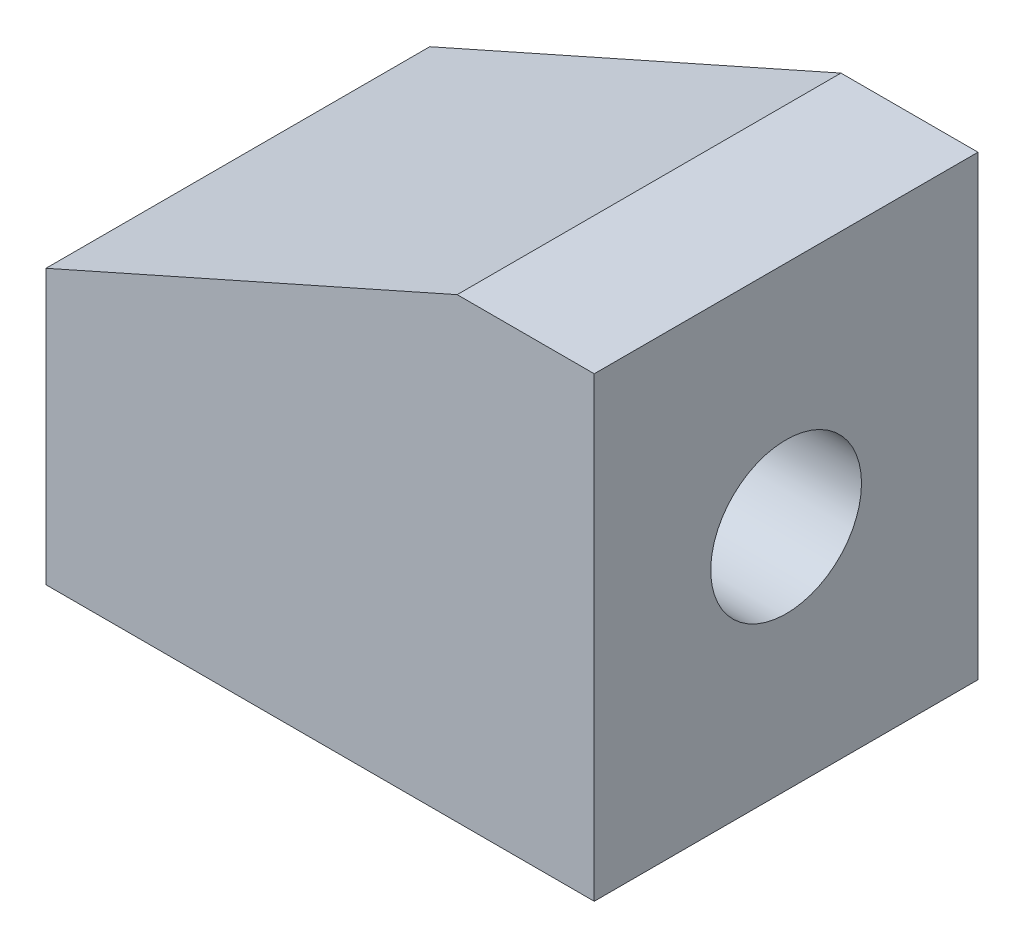
ISO-10303-21;
HEADER;
FILE_DESCRIPTION(('STEP AP214'),'2;1');
FILE_NAME('part.step','',(''),(''),'','','');
FILE_SCHEMA(('AUTOMOTIVE_DESIGN { 1 0 10303 214 1 1 1 1 }'));
ENDSEC;
DATA;
#1=APPLICATION_CONTEXT('core data for automotive mechanical design processes');
#2=APPLICATION_PROTOCOL_DEFINITION('international standard','automotive_design',2000,#1);
#3=PRODUCT_CONTEXT('',#1,'mechanical');
#4=PRODUCT('Part','Part','',(#3));
#5=PRODUCT_RELATED_PRODUCT_CATEGORY('part','',(#4));
#6=PRODUCT_DEFINITION_FORMATION('','',#4);
#7=PRODUCT_DEFINITION_CONTEXT('part definition',#1,'design');
#8=PRODUCT_DEFINITION('design','',#6,#7);
#9=PRODUCT_DEFINITION_SHAPE('','',#8);
#10=(LENGTH_UNIT() NAMED_UNIT(*) SI_UNIT(.MILLI.,.METRE.));
#11=(NAMED_UNIT(*) PLANE_ANGLE_UNIT() SI_UNIT($,.RADIAN.));
#12=(NAMED_UNIT(*) SI_UNIT($,.STERADIAN.) SOLID_ANGLE_UNIT());
#13=UNCERTAINTY_MEASURE_WITH_UNIT(LENGTH_MEASURE(1.E-05),#10,'distance_accuracy_value','');
#14=(GEOMETRIC_REPRESENTATION_CONTEXT(3) GLOBAL_UNCERTAINTY_ASSIGNED_CONTEXT((#13)) GLOBAL_UNIT_ASSIGNED_CONTEXT((#10,
#11,#12)) REPRESENTATION_CONTEXT('',''));
#15=CARTESIAN_POINT('',(0.,0.,0.));
#16=DIRECTION('',(0.,0.,1.));
#17=DIRECTION('',(1.,0.,0.));
#18=AXIS2_PLACEMENT_3D('',#15,#16,#17);
#19=CARTESIAN_POINT('',(-30.,0.,21.));
#20=DIRECTION('',(0.,1.,0.));
#21=DIRECTION('',(0.,0.,1.));
#22=AXIS2_PLACEMENT_3D('',#19,#20,#21);
#23=PLANE('',#22);
#24=DIRECTION('',(1.,0.,0.));
#25=VECTOR('',#24,1.);
#26=CARTESIAN_POINT('',(-30.,0.,-21.));
#27=LINE('',#26,#25);
#28=CARTESIAN_POINT('',(-30.,0.,-21.));
#29=VERTEX_POINT('',#28);
#30=CARTESIAN_POINT('',(30.,0.,-21.));
#31=VERTEX_POINT('',#30);
#32=EDGE_CURVE('E118',#29,#31,#27,.T.);
#33=ORIENTED_EDGE('',*,*,#32,.T.);
#34=DIRECTION('',(0.,0.,-1.));
#35=VECTOR('',#34,1.);
#36=CARTESIAN_POINT('',(30.,0.,21.));
#37=LINE('',#36,#35);
#38=CARTESIAN_POINT('',(30.,0.,21.));
#39=VERTEX_POINT('',#38);
#40=EDGE_CURVE('E11',#39,#31,#37,.T.);
#41=ORIENTED_EDGE('',*,*,#40,.F.);
#42=DIRECTION('',(1.,0.,0.));
#43=VECTOR('',#42,1.);
#44=CARTESIAN_POINT('',(-30.,0.,21.));
#45=LINE('',#44,#43);
#46=CARTESIAN_POINT('',(-30.,0.,21.));
#47=VERTEX_POINT('',#46);
#48=EDGE_CURVE('E127',#47,#39,#45,.T.);
#49=ORIENTED_EDGE('',*,*,#48,.F.);
#50=DIRECTION('',(0.,0.,-1.));
#51=VECTOR('',#50,1.);
#52=CARTESIAN_POINT('',(-30.,0.,21.));
#53=LINE('',#52,#51);
#54=EDGE_CURVE('E114',#47,#29,#53,.T.);
#55=ORIENTED_EDGE('',*,*,#54,.T.);
#56=EDGE_LOOP('',(#33,#41,#49,#55));
#57=FACE_BOUND('',#56,.T.);
#58=ADVANCED_FACE('F42',(#57),#23,.F.);
#59=CARTESIAN_POINT('',(30.,0.,21.));
#60=DIRECTION('',(-1.,0.,0.));
#61=DIRECTION('',(0.,0.,1.));
#62=AXIS2_PLACEMENT_3D('',#59,#60,#61);
#63=PLANE('',#62);
#64=CARTESIAN_POINT('',(30.,25.,0.));
#65=DIRECTION('',(1.,0.,0.));
#66=DIRECTION('',(0.,0.,-1.));
#67=AXIS2_PLACEMENT_3D('',#64,#65,#66);
#68=CIRCLE('',#67,8.24999999999999);
#69=CARTESIAN_POINT('',(30.,25.,-8.24999999999999));
#70=VERTEX_POINT('',#69);
#71=EDGE_CURVE('E157',#70,#70,#68,.T.);
#72=ORIENTED_EDGE('',*,*,#71,.F.);
#73=EDGE_LOOP('',(#72));
#74=FACE_BOUND('',#73,.T.);
#75=DIRECTION('',(0.,1.,0.));
#76=VECTOR('',#75,1.);
#77=CARTESIAN_POINT('',(30.,0.,-21.));
#78=LINE('',#77,#76);
#79=CARTESIAN_POINT('',(30.,50.,-21.));
#80=VERTEX_POINT('',#79);
#81=EDGE_CURVE('E121',#31,#80,#78,.T.);
#82=ORIENTED_EDGE('',*,*,#81,.T.);
#83=DIRECTION('',(0.,0.,-1.));
#84=VECTOR('',#83,1.);
#85=CARTESIAN_POINT('',(30.,50.,21.));
#86=LINE('',#85,#84);
#87=CARTESIAN_POINT('',(30.,50.,21.));
#88=VERTEX_POINT('',#87);
#89=EDGE_CURVE('E50',#88,#80,#86,.T.);
#90=ORIENTED_EDGE('',*,*,#89,.F.);
#91=DIRECTION('',(0.,1.,0.));
#92=VECTOR('',#91,1.);
#93=CARTESIAN_POINT('',(30.,0.,21.));
#94=LINE('',#93,#92);
#95=EDGE_CURVE('E93',#39,#88,#94,.T.);
#96=ORIENTED_EDGE('',*,*,#95,.F.);
#97=ORIENTED_EDGE('',*,*,#40,.T.);
#98=EDGE_LOOP('',(#82,#90,#96,#97));
#99=FACE_BOUND('',#98,.T.);
#100=ADVANCED_FACE('F146',(#74,#99),#63,.F.);
#101=CARTESIAN_POINT('',(30.,50.,21.));
#102=DIRECTION('',(0.,-1.,0.));
#103=DIRECTION('',(1.,0.,0.));
#104=AXIS2_PLACEMENT_3D('',#101,#102,#103);
#105=PLANE('',#104);
#106=DIRECTION('',(-1.,0.,0.));
#107=VECTOR('',#106,1.);
#108=CARTESIAN_POINT('',(30.,50.,-21.));
#109=LINE('',#108,#107);
#110=CARTESIAN_POINT('',(15.,50.,-21.));
#111=VERTEX_POINT('',#110);
#112=EDGE_CURVE('E109',#80,#111,#109,.T.);
#113=ORIENTED_EDGE('',*,*,#112,.T.);
#114=DIRECTION('',(0.,0.,-1.));
#115=VECTOR('',#114,1.);
#116=CARTESIAN_POINT('',(15.,50.,21.));
#117=LINE('',#116,#115);
#118=CARTESIAN_POINT('',(15.,50.,21.));
#119=VERTEX_POINT('',#118);
#120=EDGE_CURVE('E106',#119,#111,#117,.T.);
#121=ORIENTED_EDGE('',*,*,#120,.F.);
#122=DIRECTION('',(-1.,0.,0.));
#123=VECTOR('',#122,1.);
#124=CARTESIAN_POINT('',(30.,50.,21.));
#125=LINE('',#124,#123);
#126=EDGE_CURVE('E98',#88,#119,#125,.T.);
#127=ORIENTED_EDGE('',*,*,#126,.F.);
#128=ORIENTED_EDGE('',*,*,#89,.T.);
#129=EDGE_LOOP('',(#113,#121,#127,#128));
#130=FACE_BOUND('',#129,.T.);
#131=ADVANCED_FACE('F107',(#130),#105,.F.);
#132=CARTESIAN_POINT('',(15.,50.,21.));
#133=DIRECTION('',(0.406138466053448,-0.913811548620257,0.));
#134=DIRECTION('',(0.913811548620257,0.406138466053448,0.));
#135=AXIS2_PLACEMENT_3D('',#132,#133,#134);
#136=PLANE('',#135);
#137=DIRECTION('',(-0.913811548620257,-0.406138466053448,0.));
#138=VECTOR('',#137,1.);
#139=CARTESIAN_POINT('',(15.,50.,-21.));
#140=LINE('',#139,#138);
#141=CARTESIAN_POINT('',(-30.,30.,-21.));
#142=VERTEX_POINT('',#141);
#143=EDGE_CURVE('E79',#111,#142,#140,.T.);
#144=ORIENTED_EDGE('',*,*,#143,.T.);
#145=DIRECTION('',(0.,0.,-1.));
#146=VECTOR('',#145,1.);
#147=CARTESIAN_POINT('',(-30.,30.,21.));
#148=LINE('',#147,#146);
#149=CARTESIAN_POINT('',(-30.,30.,21.));
#150=VERTEX_POINT('',#149);
#151=EDGE_CURVE('E110',#150,#142,#148,.T.);
#152=ORIENTED_EDGE('',*,*,#151,.F.);
#153=DIRECTION('',(-0.913811548620257,-0.406138466053448,0.));
#154=VECTOR('',#153,1.);
#155=CARTESIAN_POINT('',(15.,50.,21.));
#156=LINE('',#155,#154);
#157=EDGE_CURVE('E102',#119,#150,#156,.T.);
#158=ORIENTED_EDGE('',*,*,#157,.F.);
#159=ORIENTED_EDGE('',*,*,#120,.T.);
#160=EDGE_LOOP('',(#144,#152,#158,#159));
#161=FACE_BOUND('',#160,.T.);
#162=ADVANCED_FACE('F112',(#161),#136,.F.);
#163=CARTESIAN_POINT('',(-30.,30.,21.));
#164=DIRECTION('',(1.,0.,0.));
#165=DIRECTION('',(0.,0.,-1.));
#166=AXIS2_PLACEMENT_3D('',#163,#164,#165);
#167=PLANE('',#166);
#168=DIRECTION('',(0.,-1.,0.));
#169=VECTOR('',#168,1.);
#170=CARTESIAN_POINT('',(-30.,30.,-21.));
#171=LINE('',#170,#169);
#172=EDGE_CURVE('E85',#142,#29,#171,.T.);
#173=ORIENTED_EDGE('',*,*,#172,.T.);
#174=ORIENTED_EDGE('',*,*,#54,.F.);
#175=DIRECTION('',(0.,-1.,0.));
#176=VECTOR('',#175,1.);
#177=CARTESIAN_POINT('',(-30.,30.,21.));
#178=LINE('',#177,#176);
#179=EDGE_CURVE('E58',#150,#47,#178,.T.);
#180=ORIENTED_EDGE('',*,*,#179,.F.);
#181=ORIENTED_EDGE('',*,*,#151,.T.);
#182=EDGE_LOOP('',(#173,#174,#180,#181));
#183=FACE_BOUND('',#182,.T.);
#184=ADVANCED_FACE('F135',(#183),#167,.F.);
#185=CARTESIAN_POINT('',(0.,0.,21.));
#186=DIRECTION('',(0.,0.,1.));
#187=DIRECTION('',(1.,0.,0.));
#188=AXIS2_PLACEMENT_3D('',#185,#186,#187);
#189=PLANE('',#188);
#190=ORIENTED_EDGE('',*,*,#48,.T.);
#191=ORIENTED_EDGE('',*,*,#95,.T.);
#192=ORIENTED_EDGE('',*,*,#126,.T.);
#193=ORIENTED_EDGE('',*,*,#157,.T.);
#194=ORIENTED_EDGE('',*,*,#179,.T.);
#195=EDGE_LOOP('',(#190,#191,#192,#193,#194));
#196=FACE_BOUND('',#195,.T.);
#197=ADVANCED_FACE('F100',(#196),#189,.T.);
#198=CARTESIAN_POINT('',(0.,0.,-21.));
#199=DIRECTION('',(0.,0.,1.));
#200=DIRECTION('',(1.,0.,0.));
#201=AXIS2_PLACEMENT_3D('',#198,#199,#200);
#202=PLANE('',#201);
#203=ORIENTED_EDGE('',*,*,#32,.F.);
#204=ORIENTED_EDGE('',*,*,#172,.F.);
#205=ORIENTED_EDGE('',*,*,#143,.F.);
#206=ORIENTED_EDGE('',*,*,#112,.F.);
#207=ORIENTED_EDGE('',*,*,#81,.F.);
#208=EDGE_LOOP('',(#203,#204,#205,#206,#207));
#209=FACE_BOUND('',#208,.T.);
#210=ADVANCED_FACE('F131',(#209),#202,.F.);
#211=CARTESIAN_POINT('',(-8.54289989302262,25.,0.));
#212=DIRECTION('',(1.,0.,0.));
#213=DIRECTION('',(0.,0.,-1.));
#214=AXIS2_PLACEMENT_3D('',#211,#212,#213);
#215=CONICAL_SURFACE('',#214,8.24999999999999,1.02974425867665);
#216=CARTESIAN_POINT('',(-13.5,25.,0.));
#217=VERTEX_POINT('',#216);
#218=VERTEX_LOOP('',#217);
#219=FACE_BOUND('',#218,.T.);
#220=CARTESIAN_POINT('',(-8.54289989302262,25.,0.));
#221=DIRECTION('',(1.,0.,0.));
#222=DIRECTION('',(0.,0.,-1.));
#223=AXIS2_PLACEMENT_3D('',#220,#221,#222);
#224=CIRCLE('',#223,8.24999999999999);
#225=CARTESIAN_POINT('',(-8.54289989302262,25.,-8.24999999999999));
#226=VERTEX_POINT('',#225);
#227=EDGE_CURVE('E122',#226,#226,#224,.T.);
#228=ORIENTED_EDGE('',*,*,#227,.T.);
#229=EDGE_LOOP('',(#228));
#230=FACE_BOUND('',#229,.T.);
#231=ADVANCED_FACE('F165',(#219,#230),#215,.F.);
#232=CARTESIAN_POINT('',(30.,25.,0.));
#233=DIRECTION('',(1.,0.,0.));
#234=DIRECTION('',(0.,0.,-1.));
#235=AXIS2_PLACEMENT_3D('',#232,#233,#234);
#236=CYLINDRICAL_SURFACE('',#235,8.24999999999999);
#237=ORIENTED_EDGE('',*,*,#227,.F.);
#238=EDGE_LOOP('',(#237));
#239=FACE_BOUND('',#238,.T.);
#240=ORIENTED_EDGE('',*,*,#71,.T.);
#241=EDGE_LOOP('',(#240));
#242=FACE_BOUND('',#241,.T.);
#243=ADVANCED_FACE('F167',(#239,#242),#236,.F.);
#244=CLOSED_SHELL('',(#58,#100,#131,#162,#184,#197,#210,#231,#243));
#245=MANIFOLD_SOLID_BREP('B2',#244);
#246=ADVANCED_BREP_SHAPE_REPRESENTATION('',(#18,#245),#14);
#247=SHAPE_DEFINITION_REPRESENTATION(#9,#246);
ENDSEC;
END-ISO-10303-21;
